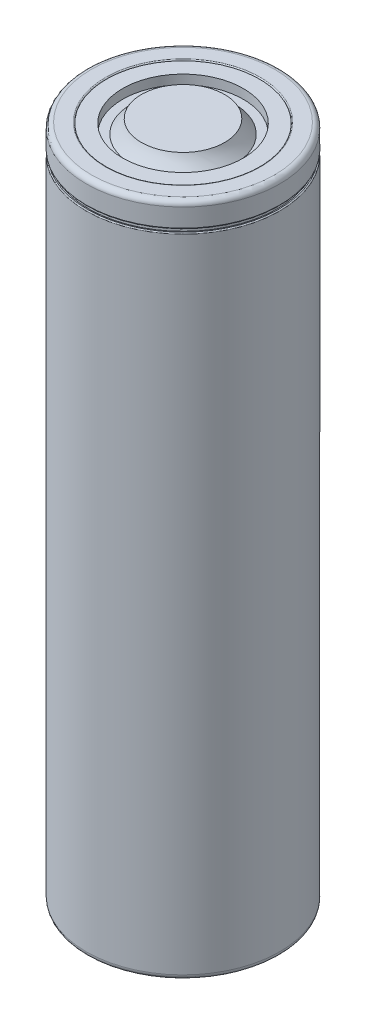
ISO-10303-21;
HEADER;
FILE_DESCRIPTION(('STEP AP214'),'2;1');
FILE_NAME('part.step','',(''),(''),'','','');
FILE_SCHEMA(('AUTOMOTIVE_DESIGN { 1 0 10303 214 1 1 1 1 }'));
ENDSEC;
DATA;
#1=APPLICATION_CONTEXT('core data for automotive mechanical design processes');
#2=APPLICATION_PROTOCOL_DEFINITION('international standard','automotive_design',2000,#1);
#3=PRODUCT_CONTEXT('',#1,'mechanical');
#4=PRODUCT('Part','Part','',(#3));
#5=PRODUCT_RELATED_PRODUCT_CATEGORY('part','',(#4));
#6=PRODUCT_DEFINITION_FORMATION('','',#4);
#7=PRODUCT_DEFINITION_CONTEXT('part definition',#1,'design');
#8=PRODUCT_DEFINITION('design','',#6,#7);
#9=PRODUCT_DEFINITION_SHAPE('','',#8);
#10=(LENGTH_UNIT() NAMED_UNIT(*) SI_UNIT(.MILLI.,.METRE.));
#11=(NAMED_UNIT(*) PLANE_ANGLE_UNIT() SI_UNIT($,.RADIAN.));
#12=(NAMED_UNIT(*) SI_UNIT($,.STERADIAN.) SOLID_ANGLE_UNIT());
#13=UNCERTAINTY_MEASURE_WITH_UNIT(LENGTH_MEASURE(1.E-05),#10,'distance_accuracy_value','');
#14=(GEOMETRIC_REPRESENTATION_CONTEXT(3) GLOBAL_UNCERTAINTY_ASSIGNED_CONTEXT((#13)) GLOBAL_UNIT_ASSIGNED_CONTEXT((#10,
#11,#12)) REPRESENTATION_CONTEXT('',''));
#15=CARTESIAN_POINT('',(0.,0.,0.));
#16=DIRECTION('',(0.,0.,1.));
#17=DIRECTION('',(1.,0.,0.));
#18=AXIS2_PLACEMENT_3D('',#15,#16,#17);
#19=CARTESIAN_POINT('',(0.,63.92,0.));
#20=DIRECTION('',(0.,1.,0.));
#21=DIRECTION('',(0.,0.,1.));
#22=AXIS2_PLACEMENT_3D('',#19,#20,#21);
#23=PLANE('',#22);
#24=CARTESIAN_POINT('',(0.,63.92,0.));
#25=DIRECTION('',(0.,1.,0.));
#26=DIRECTION('',(0.,0.,1.));
#27=AXIS2_PLACEMENT_3D('',#24,#25,#26);
#28=CIRCLE('',#27,5.8);
#29=CARTESIAN_POINT('',(0.,63.92,5.8));
#30=VERTEX_POINT('',#29);
#31=EDGE_CURVE('E302',#30,#30,#28,.T.);
#32=ORIENTED_EDGE('',*,*,#31,.T.);
#33=EDGE_LOOP('',(#32));
#34=FACE_BOUND('',#33,.T.);
#35=CARTESIAN_POINT('',(0.,63.92,0.));
#36=DIRECTION('',(0.,1.,0.));
#37=DIRECTION('',(0.,0.,1.));
#38=AXIS2_PLACEMENT_3D('',#35,#36,#37);
#39=CIRCLE('',#38,4.97813872334347);
#40=CARTESIAN_POINT('',(4.8940176038394,63.92,0.911294048132539));
#41=VERTEX_POINT('',#40);
#42=EDGE_CURVE('E148',#41,#41,#39,.T.);
#43=ORIENTED_EDGE('',*,*,#42,.F.);
#44=EDGE_LOOP('',(#43));
#45=FACE_BOUND('',#44,.T.);
#46=ADVANCED_FACE('F63',(#34,#45),#23,.T.);
#47=CARTESIAN_POINT('',(0.,64.92,0.));
#48=DIRECTION('',(0.,-1.,0.));
#49=DIRECTION('',(0.,0.,-1.));
#50=AXIS2_PLACEMENT_3D('',#47,#48,#49);
#51=CYLINDRICAL_SURFACE('',#50,9.3);
#52=DIRECTION('',(0.,-1.,0.));
#53=VECTOR('',#52,1.);
#54=CARTESIAN_POINT('',(-8.21054460375059,62.56061349589,4.36771763164953));
#55=LINE('',#54,#53);
#56=CARTESIAN_POINT('',(-8.21054460375059,62.66061349589,4.36771763164952));
#57=VERTEX_POINT('',#56);
#58=CARTESIAN_POINT('',(-8.21054460375059,62.1587302341845,4.36771763164952));
#59=VERTEX_POINT('',#58);
#60=EDGE_CURVE('E78',#57,#59,#55,.T.);
#61=ORIENTED_EDGE('',*,*,#60,.F.);
#62=CARTESIAN_POINT('',(0.,62.66061349589,0.));
#63=DIRECTION('',(0.,1.,0.));
#64=DIRECTION('',(0.,0.,1.));
#65=AXIS2_PLACEMENT_3D('',#62,#63,#64);
#66=CIRCLE('',#65,9.3);
#67=CARTESIAN_POINT('',(-8.60197134555117,62.66061349589,3.53498075953981));
#68=VERTEX_POINT('',#67);
#69=EDGE_CURVE('E216',#57,#68,#66,.T.);
#70=ORIENTED_EDGE('',*,*,#69,.T.);
#71=DIRECTION('',(0.,1.,0.));
#72=VECTOR('',#71,1.);
#73=CARTESIAN_POINT('',(-8.60197134555117,62.2587302341845,3.53498075953981));
#74=LINE('',#73,#72);
#75=CARTESIAN_POINT('',(-8.60197134555117,62.1587302341845,3.53498075953981));
#76=VERTEX_POINT('',#75);
#77=EDGE_CURVE('E85',#76,#68,#74,.T.);
#78=ORIENTED_EDGE('',*,*,#77,.F.);
#79=CARTESIAN_POINT('',(0.,62.1587302341845,0.));
#80=DIRECTION('',(0.,-1.,0.));
#81=DIRECTION('',(0.,0.,-1.));
#82=AXIS2_PLACEMENT_3D('',#79,#80,#81);
#83=CIRCLE('',#82,9.3);
#84=EDGE_CURVE('E206',#76,#59,#83,.T.);
#85=ORIENTED_EDGE('',*,*,#84,.T.);
#86=EDGE_LOOP('',(#61,#70,#78,#85));
#87=FACE_BOUND('',#86,.T.);
#88=CARTESIAN_POINT('',(0.,64.42,0.));
#89=DIRECTION('',(0.,1.,0.));
#90=DIRECTION('',(0.,0.,1.));
#91=AXIS2_PLACEMENT_3D('',#88,#89,#90);
#92=CIRCLE('',#91,9.3);
#93=CARTESIAN_POINT('',(0.,64.42,9.3));
#94=VERTEX_POINT('',#93);
#95=EDGE_CURVE('E203',#94,#94,#92,.F.);
#96=ORIENTED_EDGE('',*,*,#95,.T.);
#97=EDGE_LOOP('',(#96));
#98=FACE_BOUND('',#97,.T.);
#99=CARTESIAN_POINT('',(0.,0.5,0.));
#100=DIRECTION('',(0.,1.,0.));
#101=DIRECTION('',(0.,0.,1.));
#102=AXIS2_PLACEMENT_3D('',#99,#100,#101);
#103=CIRCLE('',#102,9.3);
#104=CARTESIAN_POINT('',(0.,0.5,9.3));
#105=VERTEX_POINT('',#104);
#106=EDGE_CURVE('E296',#105,#105,#103,.T.);
#107=ORIENTED_EDGE('',*,*,#106,.T.);
#108=EDGE_LOOP('',(#107));
#109=FACE_BOUND('',#108,.T.);
#110=ADVANCED_FACE('F222',(#87,#98,#109),#51,.T.);
#111=CARTESIAN_POINT('',(0.,64.92,0.));
#112=DIRECTION('',(0.,1.,0.));
#113=DIRECTION('',(0.,0.,1.));
#114=AXIS2_PLACEMENT_3D('',#111,#112,#113);
#115=PLANE('',#114);
#116=CARTESIAN_POINT('',(0.,64.92,0.));
#117=DIRECTION('',(0.,1.,0.));
#118=DIRECTION('',(0.,0.,1.));
#119=AXIS2_PLACEMENT_3D('',#116,#117,#118);
#120=CIRCLE('',#119,8.8);
#121=CARTESIAN_POINT('',(0.,64.92,8.8));
#122=VERTEX_POINT('',#121);
#123=EDGE_CURVE('E284',#122,#122,#120,.T.);
#124=ORIENTED_EDGE('',*,*,#123,.T.);
#125=EDGE_LOOP('',(#124));
#126=FACE_BOUND('',#125,.T.);
#127=CARTESIAN_POINT('',(0.,64.92,0.));
#128=DIRECTION('',(0.,1.,0.));
#129=DIRECTION('',(0.,0.,1.));
#130=AXIS2_PLACEMENT_3D('',#127,#128,#129);
#131=CIRCLE('',#130,7.45692507146958);
#132=CARTESIAN_POINT('',(0.,64.92,7.45692507146958));
#133=VERTEX_POINT('',#132);
#134=EDGE_CURVE('E285',#133,#133,#131,.F.);
#135=ORIENTED_EDGE('',*,*,#134,.T.);
#136=EDGE_LOOP('',(#135));
#137=FACE_BOUND('',#136,.T.);
#138=ADVANCED_FACE('F243',(#126,#137),#115,.T.);
#139=CARTESIAN_POINT('',(0.,0.,0.));
#140=DIRECTION('',(0.,1.,0.));
#141=DIRECTION('',(0.,0.,1.));
#142=AXIS2_PLACEMENT_3D('',#139,#140,#141);
#143=PLANE('',#142);
#144=CARTESIAN_POINT('',(0.,0.,0.));
#145=DIRECTION('',(0.,1.,0.));
#146=DIRECTION('',(0.,0.,1.));
#147=AXIS2_PLACEMENT_3D('',#144,#145,#146);
#148=CIRCLE('',#147,7.6);
#149=CARTESIAN_POINT('',(0.,0.,7.6));
#150=VERTEX_POINT('',#149);
#151=EDGE_CURVE('E288',#150,#150,#148,.T.);
#152=ORIENTED_EDGE('',*,*,#151,.T.);
#153=EDGE_LOOP('',(#152));
#154=FACE_BOUND('',#153,.T.);
#155=CARTESIAN_POINT('',(0.,0.,0.));
#156=DIRECTION('',(0.,1.,0.));
#157=DIRECTION('',(0.,0.,1.));
#158=AXIS2_PLACEMENT_3D('',#155,#156,#157);
#159=CIRCLE('',#158,8.8);
#160=CARTESIAN_POINT('',(0.,0.,8.8));
#161=VERTEX_POINT('',#160);
#162=EDGE_CURVE('E293',#161,#161,#159,.F.);
#163=ORIENTED_EDGE('',*,*,#162,.T.);
#164=EDGE_LOOP('',(#163));
#165=FACE_BOUND('',#164,.T.);
#166=ADVANCED_FACE('F257',(#154,#165),#143,.F.);
#167=CARTESIAN_POINT('',(0.,0.1,0.));
#168=DIRECTION('',(0.,-1.,0.));
#169=DIRECTION('',(0.,0.,-1.));
#170=AXIS2_PLACEMENT_3D('',#167,#168,#169);
#171=PLANE('',#170);
#172=CARTESIAN_POINT('',(0.,0.1,0.));
#173=DIRECTION('',(0.,-1.,0.));
#174=DIRECTION('',(0.,0.,-1.));
#175=AXIS2_PLACEMENT_3D('',#172,#173,#174);
#176=CIRCLE('',#175,7.5);
#177=CARTESIAN_POINT('',(0.,0.1,-7.5));
#178=VERTEX_POINT('',#177);
#179=EDGE_CURVE('E299',#178,#178,#176,.T.);
#180=ORIENTED_EDGE('',*,*,#179,.T.);
#181=EDGE_LOOP('',(#180));
#182=FACE_BOUND('',#181,.T.);
#183=ADVANCED_FACE('F253',(#182),#171,.T.);
#184=CARTESIAN_POINT('',(0.,0.5,0.));
#185=DIRECTION('',(0.,1.,0.));
#186=DIRECTION('',(0.,0.,1.));
#187=AXIS2_PLACEMENT_3D('',#184,#185,#186);
#188=TOROIDAL_SURFACE('',#187,8.8,0.5);
#189=ORIENTED_EDGE('',*,*,#162,.F.);
#190=EDGE_LOOP('',(#189));
#191=FACE_BOUND('',#190,.T.);
#192=ORIENTED_EDGE('',*,*,#106,.F.);
#193=EDGE_LOOP('',(#192));
#194=FACE_BOUND('',#193,.T.);
#195=ADVANCED_FACE('F256',(#191,#194),#188,.T.);
#196=CARTESIAN_POINT('',(0.,64.82,0.));
#197=DIRECTION('',(0.,1.,0.));
#198=DIRECTION('',(0.,0.,1.));
#199=AXIS2_PLACEMENT_3D('',#196,#197,#198);
#200=PLANE('',#199);
#201=CARTESIAN_POINT('',(0.,64.82,0.));
#202=DIRECTION('',(0.,1.,0.));
#203=DIRECTION('',(0.,0.,1.));
#204=AXIS2_PLACEMENT_3D('',#201,#202,#203);
#205=CIRCLE('',#204,7.35692507146958);
#206=CARTESIAN_POINT('',(0.,64.82,7.35692507146958));
#207=VERTEX_POINT('',#206);
#208=EDGE_CURVE('E200',#207,#207,#205,.T.);
#209=ORIENTED_EDGE('',*,*,#208,.T.);
#210=EDGE_LOOP('',(#209));
#211=FACE_BOUND('',#210,.T.);
#212=CARTESIAN_POINT('',(0.,64.82,0.));
#213=DIRECTION('',(0.,1.,0.));
#214=DIRECTION('',(0.,0.,1.));
#215=AXIS2_PLACEMENT_3D('',#212,#213,#214);
#216=CIRCLE('',#215,5.8);
#217=CARTESIAN_POINT('',(0.,64.82,5.8));
#218=VERTEX_POINT('',#217);
#219=EDGE_CURVE('E304',#218,#218,#216,.F.);
#220=ORIENTED_EDGE('',*,*,#219,.T.);
#221=EDGE_LOOP('',(#220));
#222=FACE_BOUND('',#221,.T.);
#223=ADVANCED_FACE('F186',(#211,#222),#200,.T.);
#224=CARTESIAN_POINT('',(0.,63.92,0.));
#225=DIRECTION('',(0.,1.,0.));
#226=DIRECTION('',(0.,0.,1.));
#227=AXIS2_PLACEMENT_3D('',#224,#225,#226);
#228=CYLINDRICAL_SURFACE('',#227,5.8);
#229=ORIENTED_EDGE('',*,*,#31,.F.);
#230=EDGE_LOOP('',(#229));
#231=FACE_BOUND('',#230,.T.);
#232=ORIENTED_EDGE('',*,*,#219,.F.);
#233=EDGE_LOOP('',(#232));
#234=FACE_BOUND('',#233,.T.);
#235=ADVANCED_FACE('F248',(#231,#234),#228,.F.);
#236=CARTESIAN_POINT('',(0.,0.1,0.));
#237=DIRECTION('',(0.,1.,0.));
#238=DIRECTION('',(0.,0.,1.));
#239=AXIS2_PLACEMENT_3D('',#236,#237,#238);
#240=TOROIDAL_SURFACE('',#239,7.6,0.1);
#241=ORIENTED_EDGE('',*,*,#151,.F.);
#242=EDGE_LOOP('',(#241));
#243=FACE_BOUND('',#242,.T.);
#244=ORIENTED_EDGE('',*,*,#179,.F.);
#245=EDGE_LOOP('',(#244));
#246=FACE_BOUND('',#245,.T.);
#247=ADVANCED_FACE('F251',(#243,#246),#240,.T.);
#248=CARTESIAN_POINT('',(0.,64.82,0.));
#249=DIRECTION('',(0.,1.,0.));
#250=DIRECTION('',(0.,0.,1.));
#251=AXIS2_PLACEMENT_3D('',#248,#249,#250);
#252=TOROIDAL_SURFACE('',#251,7.45692507146958,0.1);
#253=ORIENTED_EDGE('',*,*,#134,.F.);
#254=EDGE_LOOP('',(#253));
#255=FACE_BOUND('',#254,.T.);
#256=ORIENTED_EDGE('',*,*,#208,.F.);
#257=EDGE_LOOP('',(#256));
#258=FACE_BOUND('',#257,.T.);
#259=ADVANCED_FACE('F270',(#255,#258),#252,.T.);
#260=CARTESIAN_POINT('',(0.,64.42,0.));
#261=DIRECTION('',(0.,1.,0.));
#262=DIRECTION('',(0.,0.,1.));
#263=AXIS2_PLACEMENT_3D('',#260,#261,#262);
#264=TOROIDAL_SURFACE('',#263,8.8,0.5);
#265=ORIENTED_EDGE('',*,*,#95,.F.);
#266=EDGE_LOOP('',(#265));
#267=FACE_BOUND('',#266,.T.);
#268=ORIENTED_EDGE('',*,*,#123,.F.);
#269=EDGE_LOOP('',(#268));
#270=FACE_BOUND('',#269,.T.);
#271=ADVANCED_FACE('F173',(#267,#270),#264,.T.);
#272=CARTESIAN_POINT('',(4.8940176038394,63.92,0.911294048132539));
#273=CARTESIAN_POINT('',(3.33769951309119,65.22,2.2044867793459));
#274=CARTESIAN_POINT('',(6.71660570010448,63.92,-8.87674115954626));
#275=CARTESIAN_POINT('',(7.74667307178298,65.22,-4.47091224683648));
#276=CARTESIAN_POINT('',(-3.07142950757432,63.92,-10.6993292558113));
#277=CARTESIAN_POINT('',(1.07127404560061,65.22,-8.87988580552827));
#278=CARTESIAN_POINT('',(-4.8940176038394,63.92,-0.911294048132539));
#279=CARTESIAN_POINT('',(-3.33769951309119,65.22,-2.2044867793459));
#280=CARTESIAN_POINT('',(-6.71660570010448,63.92,8.87674115954626));
#281=CARTESIAN_POINT('',(-7.74667307178298,65.22,4.47091224683648));
#282=CARTESIAN_POINT('',(3.07142950757432,63.92,10.6993292558113));
#283=CARTESIAN_POINT('',(-1.07127404560061,65.22,8.87988580552827));
#284=CARTESIAN_POINT('',(4.8940176038394,63.92,0.911294048132539));
#285=CARTESIAN_POINT('',(3.33769951309119,65.22,2.2044867793459));
#286=(BOUNDED_SURFACE() B_SPLINE_SURFACE(3,1,((#272,#273),(#274,#275),(#276,#277),(#278,#279),
(#280,#281),(#282,#283),(#284,#285)),.UNSPECIFIED.,.T.,.F.,.F.) B_SPLINE_SURFACE_WITH_KNOTS((4,
3,4),(2,2),(0.,0.5,1.),(0.,1.),
.UNSPECIFIED.) GEOMETRIC_REPRESENTATION_ITEM() RATIONAL_B_SPLINE_SURFACE(((1.,1.),
(0.333333333333333,0.333333333333333),(0.333333333333333,0.333333333333333),(1.,1.),
(0.333333333333333,0.333333333333333),(0.333333333333333,0.333333333333333),(1.,1.))) REPRESENTATION_ITEM('') SURFACE());
#287=CARTESIAN_POINT('',(0.,65.22,0.));
#288=DIRECTION('',(0.,-1.,0.));
#289=DIRECTION('',(0.,0.,1.));
#290=AXIS2_PLACEMENT_3D('',#287,#288,#289);
#291=CIRCLE('',#290,4.);
#292=CARTESIAN_POINT('',(3.33769951309119,65.22,2.2044867793459));
#293=VERTEX_POINT('',#292);
#294=EDGE_CURVE('E153',#293,#293,#291,.T.);
#295=CARTESIAN_POINT('',(4.8940176038394,63.92,0.911294048132539));
#296=CARTESIAN_POINT('',(4.87780595706077,63.9335416666667,0.924764805749345));
#297=CARTESIAN_POINT('',(4.86159431028215,63.9470833333333,0.938235563366151));
#298=CARTESIAN_POINT('',(4.82917101672489,63.9741666666667,0.965177078599763));
#299=CARTESIAN_POINT('',(4.81295936994626,63.9877083333333,0.978647836216568));
#300=CARTESIAN_POINT('',(4.78053607638901,64.0147916666667,1.00558935145018));
#301=CARTESIAN_POINT('',(4.76432442961038,64.0283333333333,1.01906010906699));
#302=CARTESIAN_POINT('',(4.73190113605313,64.0554166666667,1.0460016243006));
#303=CARTESIAN_POINT('',(4.7156894892745,64.0689583333333,1.0594723819174));
#304=CARTESIAN_POINT('',(4.68326619571725,64.0960416666667,1.08641389715101));
#305=CARTESIAN_POINT('',(4.66705454893862,64.1095833333333,1.09988465476782));
#306=CARTESIAN_POINT('',(4.63463125538136,64.1366666666667,1.12682617000143));
#307=CARTESIAN_POINT('',(4.61841960860274,64.1502083333333,1.14029692761824));
#308=CARTESIAN_POINT('',(4.58599631504548,64.1772916666667,1.16723844285185));
#309=CARTESIAN_POINT('',(4.56978466826686,64.1908333333333,1.18070920046865));
#310=CARTESIAN_POINT('',(4.5373613747096,64.2179166666667,1.20765071570227));
#311=CARTESIAN_POINT('',(4.52114972793097,64.2314583333333,1.22112147331907));
#312=CARTESIAN_POINT('',(4.48872643437372,64.2585416666667,1.24806298855269));
#313=CARTESIAN_POINT('',(4.47251478759509,64.2720833333333,1.26153374616949));
#314=CARTESIAN_POINT('',(4.44009149403784,64.2991666666667,1.2884752614031));
#315=CARTESIAN_POINT('',(4.42387984725921,64.3127083333333,1.30194601901991));
#316=CARTESIAN_POINT('',(4.39145655370196,64.3397916666667,1.32888753425352));
#317=CARTESIAN_POINT('',(4.37524490692333,64.3533333333333,1.34235829187033));
#318=CARTESIAN_POINT('',(4.34282161336608,64.3804166666667,1.36929980710394));
#319=CARTESIAN_POINT('',(4.32660996658745,64.3939583333333,1.38277056472074));
#320=CARTESIAN_POINT('',(4.29418667303019,64.4210416666667,1.40971207995435));
#321=CARTESIAN_POINT('',(4.27797502625157,64.4345833333333,1.42318283757116));
#322=CARTESIAN_POINT('',(4.24555173269431,64.4616666666667,1.45012435280477));
#323=CARTESIAN_POINT('',(4.22934008591568,64.4752083333333,1.46359511042158));
#324=CARTESIAN_POINT('',(4.19691679235843,64.5022916666667,1.49053662565519));
#325=CARTESIAN_POINT('',(4.1807051455798,64.5158333333333,1.504007383272));
#326=CARTESIAN_POINT('',(4.14828185202255,64.5429166666667,1.53094889850561));
#327=CARTESIAN_POINT('',(4.13207020524392,64.5564583333333,1.54441965612241));
#328=CARTESIAN_POINT('',(4.09964691168667,64.5835416666667,1.57136117135602));
#329=CARTESIAN_POINT('',(4.08343526490804,64.5970833333333,1.58483192897283));
#330=CARTESIAN_POINT('',(4.05101197135079,64.6241666666667,1.61177344420644));
#331=CARTESIAN_POINT('',(4.03480032457216,64.6377083333333,1.62524420182325));
#332=CARTESIAN_POINT('',(4.0023770310149,64.6647916666667,1.65218571705686));
#333=CARTESIAN_POINT('',(3.98616538423628,64.6783333333333,1.66565647467367));
#334=CARTESIAN_POINT('',(3.95374209067902,64.7054166666667,1.69259798990728));
#335=CARTESIAN_POINT('',(3.93753044390039,64.7189583333333,1.70606874752408));
#336=CARTESIAN_POINT('',(3.90510715034314,64.7460416666667,1.73301026275769));
#337=CARTESIAN_POINT('',(3.88889550356451,64.7595833333333,1.7464810203745));
#338=CARTESIAN_POINT('',(3.85647221000726,64.7866666666667,1.77342253560811));
#339=CARTESIAN_POINT('',(3.84026056322863,64.8002083333333,1.78689329322492));
#340=CARTESIAN_POINT('',(3.80783726967138,64.8272916666667,1.81383480845853));
#341=CARTESIAN_POINT('',(3.79162562289275,64.8408333333333,1.82730556607534));
#342=CARTESIAN_POINT('',(3.75920232933549,64.8679166666667,1.85424708130895));
#343=CARTESIAN_POINT('',(3.74299068255687,64.8814583333333,1.86771783892575));
#344=CARTESIAN_POINT('',(3.71056738899962,64.9085416666667,1.89465935415936));
#345=CARTESIAN_POINT('',(3.69435574222099,64.9220833333333,1.90813011177617));
#346=CARTESIAN_POINT('',(3.66193244866373,64.9491666666667,1.93507162700978));
#347=CARTESIAN_POINT('',(3.6457208018851,64.9627083333333,1.94854238462659));
#348=CARTESIAN_POINT('',(3.61329750832785,64.9897916666667,1.9754838998602));
#349=CARTESIAN_POINT('',(3.59708586154922,65.0033333333333,1.988954657477));
#350=CARTESIAN_POINT('',(3.56466256799197,65.0304166666667,2.01589617271062));
#351=CARTESIAN_POINT('',(3.54845092121334,65.0439583333333,2.02936693032742));
#352=CARTESIAN_POINT('',(3.51602762765609,65.0710416666667,2.05630844556103));
#353=CARTESIAN_POINT('',(3.49981598087746,65.0845833333333,2.06977920317784));
#354=CARTESIAN_POINT('',(3.46739268732021,65.1116666666667,2.09672071841145));
#355=CARTESIAN_POINT('',(3.45118104054158,65.1252083333333,2.11019147602826));
#356=CARTESIAN_POINT('',(3.41875774698432,65.1522916666667,2.13713299126187));
#357=CARTESIAN_POINT('',(3.4025461002057,65.1658333333333,2.15060374887867));
#358=CARTESIAN_POINT('',(3.37012280664844,65.1929166666667,2.17754526411229));
#359=CARTESIAN_POINT('',(3.35391115986982,65.2064583333333,2.19101602172909));
#360=CARTESIAN_POINT('',(3.33769951309119,65.22,2.2044867793459));
#361=B_SPLINE_CURVE_WITH_KNOTS('',3,(#295,#296,#297,#298,#299,#300,#301,#302,#303,#304,#305,
#306,#307,#308,#309,#310,#311,#312,#313,#314,#315,#316,#317,#318,#319,#320,#321,#322,#323,#324,
#325,#326,#327,#328,#329,#330,#331,#332,#333,#334,#335,#336,#337,#338,#339,#340,#341,#342,#343,
#344,#345,#346,#347,#348,#349,#350,#351,#352,#353,#354,#355,#356,#357,#358,#359,#360),
.UNSPECIFIED.,.F.,.F.,(4,2,2,2,2,2,2,2,2,2,2,2,2,2,2,2,2,2,2,2,2,2,2,2,2,2,2,2,2,2,2,2,4),(0.,
0.0751591634028185,0.150318326805636,0.225477490208455,0.300636653611274,0.375795817014085,
0.450954980416903,0.526114143819721,0.601273307222532,0.676432470625358,0.751591634028169,
0.826750797430987,0.901909960833806,0.977069124236616,1.05222828763943,1.12738745104225,
1.20254661444507,1.27770577784789,1.35286494125071,1.42802410465352,1.50318326805634,
1.57834243145916,1.65350159486197,1.72866075826478,1.80381992166761,1.87897908507042,
1.95413824847324,2.02929741187606,2.10445657527888,2.1796157386817,2.25477490208451,
2.32993406548733,2.40509322889014),.UNSPECIFIED.);
#362=EDGE_CURVE('BSEAM160',#41,#293,#361,.T.);
#363=ORIENTED_EDGE('',*,*,#42,.T.);
#364=ORIENTED_EDGE('',*,*,#294,.T.);
#365=ORIENTED_EDGE('',*,*,#362,.T.);
#366=ORIENTED_EDGE('',*,*,#362,.F.);
#367=EDGE_LOOP('',(#363,#365,#364,#366));
#368=FACE_BOUND('',#367,.T.);
#369=ADVANCED_FACE('F160',(#368),#286,.T.);
#370=CARTESIAN_POINT('',(0.,65.22,0.));
#371=DIRECTION('',(0.,1.,0.));
#372=DIRECTION('',(0.,0.,1.));
#373=AXIS2_PLACEMENT_3D('',#370,#371,#372);
#374=PLANE('',#373);
#375=ORIENTED_EDGE('',*,*,#294,.F.);
#376=EDGE_LOOP('',(#375));
#377=FACE_BOUND('',#376,.T.);
#378=ADVANCED_FACE('F172',(#377),#374,.T.);
#379=CARTESIAN_POINT('',(0.,0.,0.));
#380=DIRECTION('',(-0.380105458015037,0.,-0.924943155435608));
#381=DIRECTION('',(-0.924943155435608,0.,0.380105458015037));
#382=AXIS2_PLACEMENT_3D('',#379,#380,#381);
#383=PLANE('',#382);
#384=ORIENTED_EDGE('',*,*,#77,.T.);
#385=CARTESIAN_POINT('',(-8.50947703000759,62.66061349589,3.49697021373834));
#386=DIRECTION('',(-0.380105458015037,0.,-0.924943155435608));
#387=DIRECTION('',(-0.924943155435608,0.,0.380105458015037));
#388=AXIS2_PLACEMENT_3D('',#385,#386,#387);
#389=CIRCLE('',#388,0.1);
#390=CARTESIAN_POINT('',(-8.50947703000761,62.56061349589,3.49697021373831));
#391=VERTEX_POINT('',#390);
#392=EDGE_CURVE('E13',#68,#391,#389,.F.);
#393=ORIENTED_EDGE('',*,*,#392,.T.);
#394=DIRECTION('',(0.924943155435608,0.,-0.380105458015037));
#395=VECTOR('',#394,1.);
#396=CARTESIAN_POINT('',(-8.60197134555117,62.56061349589,3.53498075953981));
#397=LINE('',#396,#395);
#398=CARTESIAN_POINT('',(-8.41652517855607,62.56061349589,3.45877164352164));
#399=VERTEX_POINT('',#398);
#400=EDGE_CURVE('E114',#391,#399,#397,.T.);
#401=ORIENTED_EDGE('',*,*,#400,.T.);
#402=DIRECTION('',(0.,-1.,0.));
#403=VECTOR('',#402,1.);
#404=CARTESIAN_POINT('',(-8.41652517855607,62.56061349589,3.45877164352164));
#405=LINE('',#404,#403);
#406=CARTESIAN_POINT('',(-8.41652517855607,62.2587302341845,3.45877164352164));
#407=VERTEX_POINT('',#406);
#408=EDGE_CURVE('E118',#399,#407,#405,.T.);
#409=ORIENTED_EDGE('',*,*,#408,.T.);
#410=DIRECTION('',(-0.924943155435608,0.,0.380105458015037));
#411=VECTOR('',#410,1.);
#412=CARTESIAN_POINT('',(-8.41652517855607,62.2587302341845,3.45877164352164));
#413=LINE('',#412,#411);
#414=CARTESIAN_POINT('',(-8.50947703000761,62.2587302341845,3.49697021373831));
#415=VERTEX_POINT('',#414);
#416=EDGE_CURVE('E132',#407,#415,#413,.T.);
#417=ORIENTED_EDGE('',*,*,#416,.T.);
#418=CARTESIAN_POINT('',(-8.50947703000759,62.1587302341845,3.49697021373834));
#419=DIRECTION('',(-0.380105458015037,0.,-0.924943155435608));
#420=DIRECTION('',(-0.924943155435608,0.,0.380105458015037));
#421=AXIS2_PLACEMENT_3D('',#418,#419,#420);
#422=CIRCLE('',#421,0.1);
#423=EDGE_CURVE('E212',#415,#76,#422,.F.);
#424=ORIENTED_EDGE('',*,*,#423,.T.);
#425=EDGE_LOOP('',(#384,#393,#401,#409,#417,#424));
#426=FACE_BOUND('',#425,.T.);
#427=ADVANCED_FACE('F116',(#426),#383,.T.);
#428=CARTESIAN_POINT('',(0.,0.,0.));
#429=DIRECTION('',(-0.469647057166619,0.,-0.882854258467803));
#430=DIRECTION('',(-0.882854258467803,0.,0.469647057166619));
#431=AXIS2_PLACEMENT_3D('',#428,#429,#430);
#432=PLANE('',#431);
#433=ORIENTED_EDGE('',*,*,#60,.T.);
#434=CARTESIAN_POINT('',(-8.12225917790379,62.1587302341845,4.3207529259329));
#435=DIRECTION('',(-0.469647057166619,0.,-0.882854258467803));
#436=DIRECTION('',(-0.882854258467803,0.,0.469647057166619));
#437=AXIS2_PLACEMENT_3D('',#434,#435,#436);
#438=CIRCLE('',#437,0.1);
#439=CARTESIAN_POINT('',(-8.12225917790381,62.2587302341845,4.32075292593286));
#440=VERTEX_POINT('',#439);
#441=EDGE_CURVE('E210',#59,#440,#438,.T.);
#442=ORIENTED_EDGE('',*,*,#441,.T.);
#443=DIRECTION('',(-0.882854258467803,0.,0.469647057166619));
#444=VECTOR('',#443,1.);
#445=CARTESIAN_POINT('',(-8.03353703600331,62.2587302341845,4.27355590281219));
#446=LINE('',#445,#444);
#447=CARTESIAN_POINT('',(-8.03353703600331,62.2587302341845,4.27355590281219));
#448=VERTEX_POINT('',#447);
#449=EDGE_CURVE('E144',#448,#440,#446,.T.);
#450=ORIENTED_EDGE('',*,*,#449,.F.);
#451=DIRECTION('',(0.,-1.,0.));
#452=VECTOR('',#451,1.);
#453=CARTESIAN_POINT('',(-8.03353703600331,62.56061349589,4.27355590281219));
#454=LINE('',#453,#452);
#455=CARTESIAN_POINT('',(-8.03353703600331,62.56061349589,4.27355590281219));
#456=VERTEX_POINT('',#455);
#457=EDGE_CURVE('E138',#456,#448,#454,.T.);
#458=ORIENTED_EDGE('',*,*,#457,.F.);
#459=DIRECTION('',(0.882854258467803,0.,-0.469647057166619));
#460=VECTOR('',#459,1.);
#461=CARTESIAN_POINT('',(-8.21054460375059,62.56061349589,4.36771763164953));
#462=LINE('',#461,#460);
#463=CARTESIAN_POINT('',(-8.12225917790381,62.56061349589,4.32075292593286));
#464=VERTEX_POINT('',#463);
#465=EDGE_CURVE('E136',#464,#456,#462,.T.);
#466=ORIENTED_EDGE('',*,*,#465,.F.);
#467=CARTESIAN_POINT('',(-8.12225917790379,62.66061349589,4.3207529259329));
#468=DIRECTION('',(-0.469647057166619,0.,-0.882854258467803));
#469=DIRECTION('',(-0.882854258467803,0.,0.469647057166619));
#470=AXIS2_PLACEMENT_3D('',#467,#468,#469);
#471=CIRCLE('',#470,0.1);
#472=EDGE_CURVE('E71',#464,#57,#471,.T.);
#473=ORIENTED_EDGE('',*,*,#472,.T.);
#474=EDGE_LOOP('',(#433,#442,#450,#458,#466,#473));
#475=FACE_BOUND('',#474,.T.);
#476=ADVANCED_FACE('F219',(#475),#432,.F.);
#477=CARTESIAN_POINT('',(-8.60197134555117,62.56061349589,3.53498075953981));
#478=DIRECTION('',(0.,1.,0.));
#479=DIRECTION('',(0.,0.,1.));
#480=AXIS2_PLACEMENT_3D('',#477,#478,#479);
#481=PLANE('',#480);
#482=ORIENTED_EDGE('',*,*,#400,.F.);
#483=CARTESIAN_POINT('',(0.,62.56061349589,0.));
#484=DIRECTION('',(0.,1.,0.));
#485=DIRECTION('',(0.,0.,1.));
#486=AXIS2_PLACEMENT_3D('',#483,#484,#485);
#487=CIRCLE('',#486,9.2);
#488=EDGE_CURVE('E214',#391,#464,#487,.F.);
#489=ORIENTED_EDGE('',*,*,#488,.T.);
#490=ORIENTED_EDGE('',*,*,#465,.T.);
#491=CARTESIAN_POINT('',(0.,62.56061349589,0.));
#492=DIRECTION('',(0.,-1.,0.));
#493=DIRECTION('',(-0.924943155435609,0.,0.380105458015033));
#494=AXIS2_PLACEMENT_3D('',#491,#492,#493);
#495=CIRCLE('',#494,9.09950533618711);
#496=EDGE_CURVE('E129',#399,#456,#495,.T.);
#497=ORIENTED_EDGE('',*,*,#496,.F.);
#498=EDGE_LOOP('',(#482,#489,#490,#497));
#499=FACE_BOUND('',#498,.T.);
#500=ADVANCED_FACE('F134',(#499),#481,.F.);
#501=CARTESIAN_POINT('',(0.,62.56061349589,0.));
#502=DIRECTION('',(0.,-1.,0.));
#503=DIRECTION('',(0.,0.,-1.));
#504=AXIS2_PLACEMENT_3D('',#501,#502,#503);
#505=CYLINDRICAL_SURFACE('',#504,9.09950533618711);
#506=CARTESIAN_POINT('',(0.,62.2587302341845,0.));
#507=DIRECTION('',(0.,-1.,0.));
#508=DIRECTION('',(-0.924943155435609,0.,0.380105458015033));
#509=AXIS2_PLACEMENT_3D('',#506,#507,#508);
#510=CIRCLE('',#509,9.09950533618711);
#511=EDGE_CURVE('E131',#407,#448,#510,.T.);
#512=ORIENTED_EDGE('',*,*,#511,.F.);
#513=ORIENTED_EDGE('',*,*,#408,.F.);
#514=ORIENTED_EDGE('',*,*,#496,.T.);
#515=ORIENTED_EDGE('',*,*,#457,.T.);
#516=EDGE_LOOP('',(#512,#513,#514,#515));
#517=FACE_BOUND('',#516,.T.);
#518=ADVANCED_FACE('F128',(#517),#505,.T.);
#519=CARTESIAN_POINT('',(-8.41652517855607,62.2587302341845,3.45877164352164));
#520=DIRECTION('',(0.,-1.,0.));
#521=DIRECTION('',(0.,0.,-1.));
#522=AXIS2_PLACEMENT_3D('',#519,#520,#521);
#523=PLANE('',#522);
#524=ORIENTED_EDGE('',*,*,#449,.T.);
#525=CARTESIAN_POINT('',(0.,62.2587302341845,0.));
#526=DIRECTION('',(0.,-1.,0.));
#527=DIRECTION('',(0.,0.,-1.));
#528=AXIS2_PLACEMENT_3D('',#525,#526,#527);
#529=CIRCLE('',#528,9.2);
#530=EDGE_CURVE('E208',#440,#415,#529,.F.);
#531=ORIENTED_EDGE('',*,*,#530,.T.);
#532=ORIENTED_EDGE('',*,*,#416,.F.);
#533=ORIENTED_EDGE('',*,*,#511,.T.);
#534=EDGE_LOOP('',(#524,#531,#532,#533));
#535=FACE_BOUND('',#534,.T.);
#536=ADVANCED_FACE('F185',(#535),#523,.F.);
#537=CARTESIAN_POINT('',(0.,62.1587302341845,0.));
#538=DIRECTION('',(0.,-1.,0.));
#539=DIRECTION('',(0.,0.,-1.));
#540=AXIS2_PLACEMENT_3D('',#537,#538,#539);
#541=TOROIDAL_SURFACE('',#540,9.2,0.1);
#542=ORIENTED_EDGE('',*,*,#423,.F.);
#543=ORIENTED_EDGE('',*,*,#530,.F.);
#544=ORIENTED_EDGE('',*,*,#441,.F.);
#545=ORIENTED_EDGE('',*,*,#84,.F.);
#546=EDGE_LOOP('',(#542,#543,#544,#545));
#547=FACE_BOUND('',#546,.T.);
#548=ADVANCED_FACE('F228',(#547),#541,.T.);
#549=CARTESIAN_POINT('',(0.,62.66061349589,0.));
#550=DIRECTION('',(0.,1.,0.));
#551=DIRECTION('',(0.,0.,1.));
#552=AXIS2_PLACEMENT_3D('',#549,#550,#551);
#553=TOROIDAL_SURFACE('',#552,9.2,0.1);
#554=ORIENTED_EDGE('',*,*,#392,.F.);
#555=ORIENTED_EDGE('',*,*,#69,.F.);
#556=ORIENTED_EDGE('',*,*,#472,.F.);
#557=ORIENTED_EDGE('',*,*,#488,.F.);
#558=EDGE_LOOP('',(#554,#555,#556,#557));
#559=FACE_BOUND('',#558,.T.);
#560=ADVANCED_FACE('F65',(#559),#553,.T.);
#561=CLOSED_SHELL('',(#46,#110,#138,#166,#183,#195,#223,#235,#247,#259,#271,#369,#378,#427,#476,
#500,#518,#536,#548,#560));
#562=MANIFOLD_SOLID_BREP('B2',#561);
#563=ADVANCED_BREP_SHAPE_REPRESENTATION('',(#18,#562),#14);
#564=SHAPE_DEFINITION_REPRESENTATION(#9,#563);
ENDSEC;
END-ISO-10303-21;
